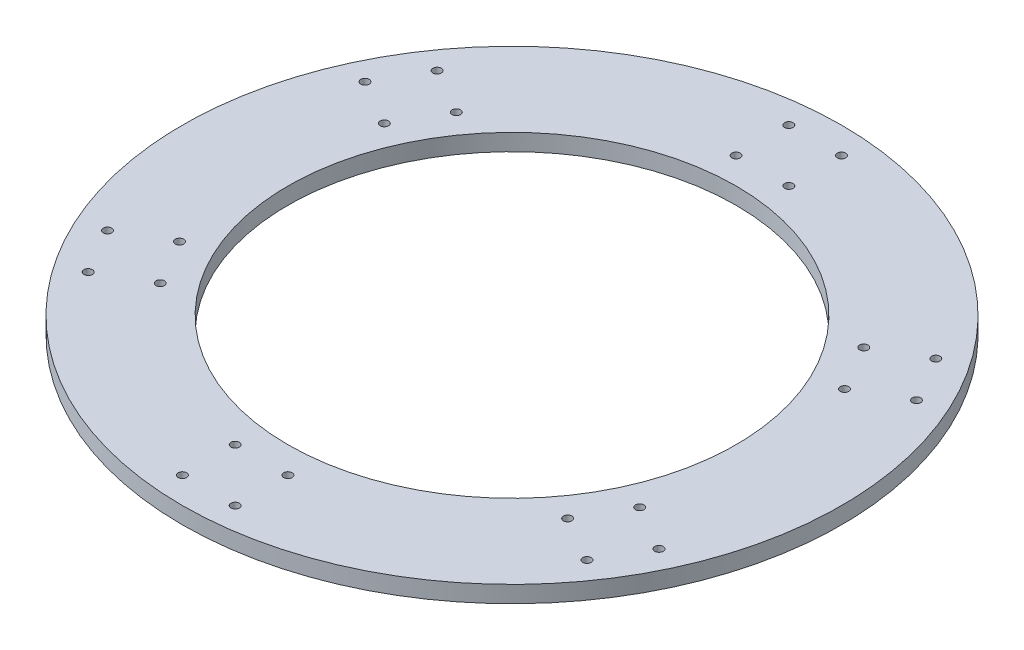
ISO-10303-21;
HEADER;
FILE_DESCRIPTION(('STEP AP214'),'2;1');
FILE_NAME('part.step','',(''),(''),'','','');
FILE_SCHEMA(('AUTOMOTIVE_DESIGN { 1 0 10303 214 1 1 1 1 }'));
ENDSEC;
DATA;
#1=APPLICATION_CONTEXT('core data for automotive mechanical design processes');
#2=APPLICATION_PROTOCOL_DEFINITION('international standard','automotive_design',2000,#1);
#3=PRODUCT_CONTEXT('',#1,'mechanical');
#4=PRODUCT('Part','Part','',(#3));
#5=PRODUCT_RELATED_PRODUCT_CATEGORY('part','',(#4));
#6=PRODUCT_DEFINITION_FORMATION('','',#4);
#7=PRODUCT_DEFINITION_CONTEXT('part definition',#1,'design');
#8=PRODUCT_DEFINITION('design','',#6,#7);
#9=PRODUCT_DEFINITION_SHAPE('','',#8);
#10=(LENGTH_UNIT() NAMED_UNIT(*) SI_UNIT(.MILLI.,.METRE.));
#11=(NAMED_UNIT(*) PLANE_ANGLE_UNIT() SI_UNIT($,.RADIAN.));
#12=(NAMED_UNIT(*) SI_UNIT($,.STERADIAN.) SOLID_ANGLE_UNIT());
#13=UNCERTAINTY_MEASURE_WITH_UNIT(LENGTH_MEASURE(1.E-05),#10,'distance_accuracy_value','');
#14=(GEOMETRIC_REPRESENTATION_CONTEXT(3) GLOBAL_UNCERTAINTY_ASSIGNED_CONTEXT((#13)) GLOBAL_UNIT_ASSIGNED_CONTEXT((#10,
#11,#12)) REPRESENTATION_CONTEXT('',''));
#15=CARTESIAN_POINT('',(0.,0.,0.));
#16=DIRECTION('',(0.,0.,1.));
#17=DIRECTION('',(1.,0.,0.));
#18=AXIS2_PLACEMENT_3D('',#15,#16,#17);
#19=CARTESIAN_POINT('',(0.,6.35,0.));
#20=DIRECTION('',(0.,1.,0.));
#21=DIRECTION('',(0.,0.,1.));
#22=AXIS2_PLACEMENT_3D('',#19,#20,#21);
#23=PLANE('',#22);
#24=CARTESIAN_POINT('',(-10.,6.35,95.));
#25=DIRECTION('',(0.,-1.,0.));
#26=DIRECTION('',(0.,0.,-1.));
#27=AXIS2_PLACEMENT_3D('',#24,#25,#26);
#28=CIRCLE('',#27,1.6);
#29=CARTESIAN_POINT('',(-10.,6.35,93.4));
#30=VERTEX_POINT('',#29);
#31=EDGE_CURVE('E189',#30,#30,#28,.T.);
#32=ORIENTED_EDGE('',*,*,#31,.T.);
#33=EDGE_LOOP('',(#32));
#34=FACE_BOUND('',#33,.T.);
#35=CARTESIAN_POINT('',(9.99999999999998,6.35,95.));
#36=DIRECTION('',(0.,-1.,0.));
#37=DIRECTION('',(0.,0.,-1.));
#38=AXIS2_PLACEMENT_3D('',#35,#36,#37);
#39=CIRCLE('',#38,1.6);
#40=CARTESIAN_POINT('',(9.99999999999998,6.35,93.4));
#41=VERTEX_POINT('',#40);
#42=EDGE_CURVE('E183',#41,#41,#39,.T.);
#43=ORIENTED_EDGE('',*,*,#42,.T.);
#44=EDGE_LOOP('',(#43));
#45=FACE_BOUND('',#44,.T.);
#46=CARTESIAN_POINT('',(-10.,6.35,115.));
#47=DIRECTION('',(0.,-1.,0.));
#48=DIRECTION('',(0.,0.,-1.));
#49=AXIS2_PLACEMENT_3D('',#46,#47,#48);
#50=CIRCLE('',#49,1.6);
#51=CARTESIAN_POINT('',(-10.,6.35,113.4));
#52=VERTEX_POINT('',#51);
#53=EDGE_CURVE('E177',#52,#52,#50,.T.);
#54=ORIENTED_EDGE('',*,*,#53,.T.);
#55=EDGE_LOOP('',(#54));
#56=FACE_BOUND('',#55,.T.);
#57=CARTESIAN_POINT('',(94.5929214352102,6.35,-66.1602540378448));
#58=DIRECTION('',(0.,-1.,0.));
#59=DIRECTION('',(0.,0.,-1.));
#60=AXIS2_PLACEMENT_3D('',#57,#58,#59);
#61=CIRCLE('',#60,1.6);
#62=CARTESIAN_POINT('',(94.5929214352102,6.35,-67.7602540378448));
#63=VERTEX_POINT('',#62);
#64=EDGE_CURVE('E129',#63,#63,#61,.T.);
#65=ORIENTED_EDGE('',*,*,#64,.T.);
#66=EDGE_LOOP('',(#65));
#67=FACE_BOUND('',#66,.T.);
#68=CARTESIAN_POINT('',(77.2724133595218,6.35,56.1602540378443));
#69=DIRECTION('',(0.,-1.,0.));
#70=DIRECTION('',(0.,0.,-1.));
#71=AXIS2_PLACEMENT_3D('',#68,#69,#70);
#72=CIRCLE('',#71,1.6);
#73=CARTESIAN_POINT('',(77.2724133595218,6.35,54.5602540378443));
#74=VERTEX_POINT('',#73);
#75=EDGE_CURVE('E123',#74,#74,#72,.T.);
#76=ORIENTED_EDGE('',*,*,#75,.T.);
#77=EDGE_LOOP('',(#76));
#78=FACE_BOUND('',#77,.T.);
#79=CARTESIAN_POINT('',(9.99999999999935,6.35,-95.0000000000001));
#80=DIRECTION('',(0.,-1.,0.));
#81=DIRECTION('',(0.,0.,-1.));
#82=AXIS2_PLACEMENT_3D('',#79,#80,#81);
#83=CIRCLE('',#82,1.6);
#84=CARTESIAN_POINT('',(9.99999999999935,6.35,-96.6000000000001));
#85=VERTEX_POINT('',#84);
#86=EDGE_CURVE('E117',#85,#85,#83,.T.);
#87=ORIENTED_EDGE('',*,*,#86,.T.);
#88=EDGE_LOOP('',(#87));
#89=FACE_BOUND('',#88,.T.);
#90=CARTESIAN_POINT('',(-10.0000000000006,6.35,-95.));
#91=DIRECTION('',(0.,-1.,0.));
#92=DIRECTION('',(0.,0.,-1.));
#93=AXIS2_PLACEMENT_3D('',#90,#91,#92);
#94=CIRCLE('',#93,1.6);
#95=CARTESIAN_POINT('',(-10.0000000000006,6.35,-96.6));
#96=VERTEX_POINT('',#95);
#97=EDGE_CURVE('E111',#96,#96,#94,.T.);
#98=ORIENTED_EDGE('',*,*,#97,.T.);
#99=EDGE_LOOP('',(#98));
#100=FACE_BOUND('',#99,.T.);
#101=CARTESIAN_POINT('',(9.99999999999921,6.35,-115.));
#102=DIRECTION('',(0.,-1.,0.));
#103=DIRECTION('',(0.,0.,-1.));
#104=AXIS2_PLACEMENT_3D('',#101,#102,#103);
#105=CIRCLE('',#104,1.6);
#106=CARTESIAN_POINT('',(9.99999999999921,6.35,-116.6));
#107=VERTEX_POINT('',#106);
#108=EDGE_CURVE('E105',#107,#107,#105,.T.);
#109=ORIENTED_EDGE('',*,*,#108,.T.);
#110=EDGE_LOOP('',(#109));
#111=FACE_BOUND('',#110,.T.);
#112=CARTESIAN_POINT('',(-10.0000000000008,6.35,-115.));
#113=DIRECTION('',(0.,-1.,0.));
#114=DIRECTION('',(0.,0.,-1.));
#115=AXIS2_PLACEMENT_3D('',#112,#113,#114);
#116=CIRCLE('',#115,1.6);
#117=CARTESIAN_POINT('',(-10.0000000000008,6.35,-116.6));
#118=VERTEX_POINT('',#117);
#119=EDGE_CURVE('E99',#118,#118,#116,.T.);
#120=ORIENTED_EDGE('',*,*,#119,.T.);
#121=EDGE_LOOP('',(#120));
#122=FACE_BOUND('',#121,.T.);
#123=CARTESIAN_POINT('',(-77.2724133595222,6.35,-56.1602540378437));
#124=DIRECTION('',(0.,-1.,0.));
#125=DIRECTION('',(0.,0.,-1.));
#126=AXIS2_PLACEMENT_3D('',#123,#124,#125);
#127=CIRCLE('',#126,1.6);
#128=CARTESIAN_POINT('',(-77.2724133595222,6.35,-57.7602540378437));
#129=VERTEX_POINT('',#128);
#130=EDGE_CURVE('E93',#129,#129,#127,.T.);
#131=ORIENTED_EDGE('',*,*,#130,.T.);
#132=EDGE_LOOP('',(#131));
#133=FACE_BOUND('',#132,.T.);
#134=CARTESIAN_POINT('',(-87.272413359522,6.35,-38.8397459621548));
#135=DIRECTION('',(0.,-1.,0.));
#136=DIRECTION('',(0.,0.,-1.));
#137=AXIS2_PLACEMENT_3D('',#134,#135,#136);
#138=CIRCLE('',#137,1.6);
#139=CARTESIAN_POINT('',(-87.272413359522,6.35,-40.4397459621548));
#140=VERTEX_POINT('',#139);
#141=EDGE_CURVE('E87',#140,#140,#138,.T.);
#142=ORIENTED_EDGE('',*,*,#141,.T.);
#143=EDGE_LOOP('',(#142));
#144=FACE_BOUND('',#143,.T.);
#145=CARTESIAN_POINT('',(-94.5929214352111,6.35,-66.1602540378435));
#146=DIRECTION('',(0.,-1.,0.));
#147=DIRECTION('',(0.,0.,-1.));
#148=AXIS2_PLACEMENT_3D('',#145,#146,#147);
#149=CIRCLE('',#148,1.6);
#150=CARTESIAN_POINT('',(-94.5929214352111,6.35,-67.7602540378435));
#151=VERTEX_POINT('',#150);
#152=EDGE_CURVE('E81',#151,#151,#149,.T.);
#153=ORIENTED_EDGE('',*,*,#152,.T.);
#154=EDGE_LOOP('',(#153));
#155=FACE_BOUND('',#154,.T.);
#156=CARTESIAN_POINT('',(-104.592921435211,6.35,-48.8397459621547));
#157=DIRECTION('',(0.,-1.,0.));
#158=DIRECTION('',(0.,0.,-1.));
#159=AXIS2_PLACEMENT_3D('',#156,#157,#158);
#160=CIRCLE('',#159,1.6);
#161=CARTESIAN_POINT('',(-104.592921435211,6.35,-50.4397459621547));
#162=VERTEX_POINT('',#161);
#163=EDGE_CURVE('E75',#162,#162,#160,.T.);
#164=ORIENTED_EDGE('',*,*,#163,.T.);
#165=EDGE_LOOP('',(#164));
#166=FACE_BOUND('',#165,.T.);
#167=CARTESIAN_POINT('',(-87.2724133595212,6.35,38.8397459621566));
#168=DIRECTION('',(0.,-1.,0.));
#169=DIRECTION('',(0.,0.,-1.));
#170=AXIS2_PLACEMENT_3D('',#167,#168,#169);
#171=CIRCLE('',#170,1.6);
#172=CARTESIAN_POINT('',(-87.2724133595212,6.35,37.2397459621566));
#173=VERTEX_POINT('',#172);
#174=EDGE_CURVE('E69',#173,#173,#171,.T.);
#175=ORIENTED_EDGE('',*,*,#174,.T.);
#176=EDGE_LOOP('',(#175));
#177=FACE_BOUND('',#176,.T.);
#178=CARTESIAN_POINT('',(-77.272413359521,6.35,56.1602540378453));
#179=DIRECTION('',(0.,-1.,0.));
#180=DIRECTION('',(0.,0.,-1.));
#181=AXIS2_PLACEMENT_3D('',#178,#179,#180);
#182=CIRCLE('',#181,1.6);
#183=CARTESIAN_POINT('',(-77.272413359521,6.35,54.5602540378452));
#184=VERTEX_POINT('',#183);
#185=EDGE_CURVE('E63',#184,#184,#182,.T.);
#186=ORIENTED_EDGE('',*,*,#185,.T.);
#187=EDGE_LOOP('',(#186));
#188=FACE_BOUND('',#187,.T.);
#189=CARTESIAN_POINT('',(-104.59292143521,6.35,48.8397459621568));
#190=DIRECTION('',(0.,-1.,0.));
#191=DIRECTION('',(0.,0.,-1.));
#192=AXIS2_PLACEMENT_3D('',#189,#190,#191);
#193=CIRCLE('',#192,1.6);
#194=CARTESIAN_POINT('',(-104.59292143521,6.35,47.2397459621568));
#195=VERTEX_POINT('',#194);
#196=EDGE_CURVE('E57',#195,#195,#193,.T.);
#197=ORIENTED_EDGE('',*,*,#196,.T.);
#198=EDGE_LOOP('',(#197));
#199=FACE_BOUND('',#198,.T.);
#200=CARTESIAN_POINT('',(-94.5929214352097,6.35,66.1602540378455));
#201=DIRECTION('',(0.,-1.,0.));
#202=DIRECTION('',(0.,0.,-1.));
#203=AXIS2_PLACEMENT_3D('',#200,#201,#202);
#204=CIRCLE('',#203,1.6);
#205=CARTESIAN_POINT('',(-94.5929214352097,6.35,64.5602540378455));
#206=VERTEX_POINT('',#205);
#207=EDGE_CURVE('E49',#206,#206,#204,.T.);
#208=ORIENTED_EDGE('',*,*,#207,.T.);
#209=EDGE_LOOP('',(#208));
#210=FACE_BOUND('',#209,.T.);
#211=CARTESIAN_POINT('',(0.,6.35,0.));
#212=DIRECTION('',(0.,1.,0.));
#213=DIRECTION('',(0.,0.,1.));
#214=AXIS2_PLACEMENT_3D('',#211,#212,#213);
#215=CIRCLE('',#214,85.);
#216=CARTESIAN_POINT('',(0.,6.35,85.));
#217=VERTEX_POINT('',#216);
#218=EDGE_CURVE('E44',#217,#217,#215,.T.);
#219=ORIENTED_EDGE('',*,*,#218,.F.);
#220=EDGE_LOOP('',(#219));
#221=FACE_BOUND('',#220,.T.);
#222=CARTESIAN_POINT('',(0.,6.35,0.));
#223=DIRECTION('',(0.,1.,0.));
#224=DIRECTION('',(0.,0.,1.));
#225=AXIS2_PLACEMENT_3D('',#222,#223,#224);
#226=CIRCLE('',#225,125.);
#227=CARTESIAN_POINT('',(0.,6.35,125.));
#228=VERTEX_POINT('',#227);
#229=EDGE_CURVE('E10',#228,#228,#226,.T.);
#230=ORIENTED_EDGE('',*,*,#229,.T.);
#231=EDGE_LOOP('',(#230));
#232=FACE_BOUND('',#231,.T.);
#233=CARTESIAN_POINT('',(104.59292143521,6.35,-48.839745962156));
#234=DIRECTION('',(0.,-1.,0.));
#235=DIRECTION('',(0.,0.,-1.));
#236=AXIS2_PLACEMENT_3D('',#233,#234,#235);
#237=CIRCLE('',#236,1.6);
#238=CARTESIAN_POINT('',(104.59292143521,6.35,-50.439745962156));
#239=VERTEX_POINT('',#238);
#240=EDGE_CURVE('E135',#239,#239,#237,.T.);
#241=ORIENTED_EDGE('',*,*,#240,.T.);
#242=EDGE_LOOP('',(#241));
#243=FACE_BOUND('',#242,.T.);
#244=CARTESIAN_POINT('',(77.2724133595215,6.35,-56.1602540378447));
#245=DIRECTION('',(0.,-1.,0.));
#246=DIRECTION('',(0.,0.,-1.));
#247=AXIS2_PLACEMENT_3D('',#244,#245,#246);
#248=CIRCLE('',#247,1.6);
#249=CARTESIAN_POINT('',(77.2724133595215,6.35,-57.7602540378447));
#250=VERTEX_POINT('',#249);
#251=EDGE_CURVE('E141',#250,#250,#248,.T.);
#252=ORIENTED_EDGE('',*,*,#251,.T.);
#253=EDGE_LOOP('',(#252));
#254=FACE_BOUND('',#253,.T.);
#255=CARTESIAN_POINT('',(87.2724133595216,6.35,-38.839745962156));
#256=DIRECTION('',(0.,-1.,0.));
#257=DIRECTION('',(0.,0.,-1.));
#258=AXIS2_PLACEMENT_3D('',#255,#256,#257);
#259=CIRCLE('',#258,1.6);
#260=CARTESIAN_POINT('',(87.2724133595216,6.35,-40.439745962156));
#261=VERTEX_POINT('',#260);
#262=EDGE_CURVE('E147',#261,#261,#259,.T.);
#263=ORIENTED_EDGE('',*,*,#262,.T.);
#264=EDGE_LOOP('',(#263));
#265=FACE_BOUND('',#264,.T.);
#266=CARTESIAN_POINT('',(104.592921435211,6.35,48.8397459621538));
#267=DIRECTION('',(0.,-1.,0.));
#268=DIRECTION('',(0.,0.,-1.));
#269=AXIS2_PLACEMENT_3D('',#266,#267,#268);
#270=CIRCLE('',#269,1.6);
#271=CARTESIAN_POINT('',(104.592921435211,6.35,47.2397459621538));
#272=VERTEX_POINT('',#271);
#273=EDGE_CURVE('E153',#272,#272,#270,.T.);
#274=ORIENTED_EDGE('',*,*,#273,.T.);
#275=EDGE_LOOP('',(#274));
#276=FACE_BOUND('',#275,.T.);
#277=CARTESIAN_POINT('',(94.5929214352116,6.35,66.1602540378428));
#278=DIRECTION('',(0.,-1.,0.));
#279=DIRECTION('',(0.,0.,-1.));
#280=AXIS2_PLACEMENT_3D('',#277,#278,#279);
#281=CIRCLE('',#280,1.6);
#282=CARTESIAN_POINT('',(94.5929214352116,6.35,64.5602540378428));
#283=VERTEX_POINT('',#282);
#284=EDGE_CURVE('E159',#283,#283,#281,.T.);
#285=ORIENTED_EDGE('',*,*,#284,.T.);
#286=EDGE_LOOP('',(#285));
#287=FACE_BOUND('',#286,.T.);
#288=CARTESIAN_POINT('',(87.2724133595223,6.35,38.8397459621541));
#289=DIRECTION('',(0.,-1.,0.));
#290=DIRECTION('',(0.,0.,-1.));
#291=AXIS2_PLACEMENT_3D('',#288,#289,#290);
#292=CIRCLE('',#291,1.6);
#293=CARTESIAN_POINT('',(87.2724133595223,6.35,37.2397459621541));
#294=VERTEX_POINT('',#293);
#295=EDGE_CURVE('E165',#294,#294,#292,.T.);
#296=ORIENTED_EDGE('',*,*,#295,.T.);
#297=EDGE_LOOP('',(#296));
#298=FACE_BOUND('',#297,.T.);
#299=CARTESIAN_POINT('',(9.99999999999999,6.35,115.));
#300=DIRECTION('',(0.,-1.,0.));
#301=DIRECTION('',(0.,0.,-1.));
#302=AXIS2_PLACEMENT_3D('',#299,#300,#301);
#303=CIRCLE('',#302,1.6);
#304=CARTESIAN_POINT('',(9.99999999999999,6.35,113.4));
#305=VERTEX_POINT('',#304);
#306=EDGE_CURVE('E171',#305,#305,#303,.T.);
#307=ORIENTED_EDGE('',*,*,#306,.T.);
#308=EDGE_LOOP('',(#307));
#309=FACE_BOUND('',#308,.T.);
#310=ADVANCED_FACE('F33',(#34,#45,#56,#67,#78,#89,#100,#111,#122,#133,#144,#155,#166,#177,#188,
#199,#210,#221,#232,#243,#254,#265,#276,#287,#298,#309),#23,.T.);
#311=CARTESIAN_POINT('',(0.,0.,0.));
#312=DIRECTION('',(0.,1.,0.));
#313=DIRECTION('',(0.,0.,1.));
#314=AXIS2_PLACEMENT_3D('',#311,#312,#313);
#315=PLANE('',#314);
#316=CARTESIAN_POINT('',(-10.,0.,95.));
#317=DIRECTION('',(0.,-1.,0.));
#318=DIRECTION('',(0.,0.,-1.));
#319=AXIS2_PLACEMENT_3D('',#316,#317,#318);
#320=CIRCLE('',#319,1.6);
#321=CARTESIAN_POINT('',(-10.,0.,93.4));
#322=VERTEX_POINT('',#321);
#323=EDGE_CURVE('E192',#322,#322,#320,.T.);
#324=ORIENTED_EDGE('',*,*,#323,.F.);
#325=EDGE_LOOP('',(#324));
#326=FACE_BOUND('',#325,.T.);
#327=CARTESIAN_POINT('',(9.99999999999998,0.,95.));
#328=DIRECTION('',(0.,-1.,0.));
#329=DIRECTION('',(0.,0.,-1.));
#330=AXIS2_PLACEMENT_3D('',#327,#328,#329);
#331=CIRCLE('',#330,1.6);
#332=CARTESIAN_POINT('',(9.99999999999998,0.,93.4));
#333=VERTEX_POINT('',#332);
#334=EDGE_CURVE('E186',#333,#333,#331,.T.);
#335=ORIENTED_EDGE('',*,*,#334,.F.);
#336=EDGE_LOOP('',(#335));
#337=FACE_BOUND('',#336,.T.);
#338=CARTESIAN_POINT('',(-10.,0.,115.));
#339=DIRECTION('',(0.,-1.,0.));
#340=DIRECTION('',(0.,0.,-1.));
#341=AXIS2_PLACEMENT_3D('',#338,#339,#340);
#342=CIRCLE('',#341,1.6);
#343=CARTESIAN_POINT('',(-10.,0.,113.4));
#344=VERTEX_POINT('',#343);
#345=EDGE_CURVE('E180',#344,#344,#342,.T.);
#346=ORIENTED_EDGE('',*,*,#345,.F.);
#347=EDGE_LOOP('',(#346));
#348=FACE_BOUND('',#347,.T.);
#349=CARTESIAN_POINT('',(87.2724133595223,0.,38.8397459621541));
#350=DIRECTION('',(0.,-1.,0.));
#351=DIRECTION('',(0.,0.,-1.));
#352=AXIS2_PLACEMENT_3D('',#349,#350,#351);
#353=CIRCLE('',#352,1.6);
#354=CARTESIAN_POINT('',(87.2724133595223,0.,37.2397459621541));
#355=VERTEX_POINT('',#354);
#356=EDGE_CURVE('E168',#355,#355,#353,.T.);
#357=ORIENTED_EDGE('',*,*,#356,.F.);
#358=EDGE_LOOP('',(#357));
#359=FACE_BOUND('',#358,.T.);
#360=CARTESIAN_POINT('',(94.5929214352116,0.,66.1602540378428));
#361=DIRECTION('',(0.,-1.,0.));
#362=DIRECTION('',(0.,0.,-1.));
#363=AXIS2_PLACEMENT_3D('',#360,#361,#362);
#364=CIRCLE('',#363,1.6);
#365=CARTESIAN_POINT('',(94.5929214352116,0.,64.5602540378428));
#366=VERTEX_POINT('',#365);
#367=EDGE_CURVE('E162',#366,#366,#364,.T.);
#368=ORIENTED_EDGE('',*,*,#367,.F.);
#369=EDGE_LOOP('',(#368));
#370=FACE_BOUND('',#369,.T.);
#371=CARTESIAN_POINT('',(104.592921435211,0.,48.8397459621538));
#372=DIRECTION('',(0.,-1.,0.));
#373=DIRECTION('',(0.,0.,-1.));
#374=AXIS2_PLACEMENT_3D('',#371,#372,#373);
#375=CIRCLE('',#374,1.6);
#376=CARTESIAN_POINT('',(104.592921435211,0.,47.2397459621538));
#377=VERTEX_POINT('',#376);
#378=EDGE_CURVE('E156',#377,#377,#375,.T.);
#379=ORIENTED_EDGE('',*,*,#378,.F.);
#380=EDGE_LOOP('',(#379));
#381=FACE_BOUND('',#380,.T.);
#382=CARTESIAN_POINT('',(87.2724133595216,0.,-38.839745962156));
#383=DIRECTION('',(0.,-1.,0.));
#384=DIRECTION('',(0.,0.,-1.));
#385=AXIS2_PLACEMENT_3D('',#382,#383,#384);
#386=CIRCLE('',#385,1.6);
#387=CARTESIAN_POINT('',(87.2724133595216,0.,-40.439745962156));
#388=VERTEX_POINT('',#387);
#389=EDGE_CURVE('E150',#388,#388,#386,.T.);
#390=ORIENTED_EDGE('',*,*,#389,.F.);
#391=EDGE_LOOP('',(#390));
#392=FACE_BOUND('',#391,.T.);
#393=CARTESIAN_POINT('',(77.2724133595215,0.,-56.1602540378447));
#394=DIRECTION('',(0.,-1.,0.));
#395=DIRECTION('',(0.,0.,-1.));
#396=AXIS2_PLACEMENT_3D('',#393,#394,#395);
#397=CIRCLE('',#396,1.6);
#398=CARTESIAN_POINT('',(77.2724133595215,0.,-57.7602540378447));
#399=VERTEX_POINT('',#398);
#400=EDGE_CURVE('E144',#399,#399,#397,.T.);
#401=ORIENTED_EDGE('',*,*,#400,.F.);
#402=EDGE_LOOP('',(#401));
#403=FACE_BOUND('',#402,.T.);
#404=CARTESIAN_POINT('',(104.59292143521,0.,-48.839745962156));
#405=DIRECTION('',(0.,-1.,0.));
#406=DIRECTION('',(0.,0.,-1.));
#407=AXIS2_PLACEMENT_3D('',#404,#405,#406);
#408=CIRCLE('',#407,1.6);
#409=CARTESIAN_POINT('',(104.59292143521,0.,-50.439745962156));
#410=VERTEX_POINT('',#409);
#411=EDGE_CURVE('E138',#410,#410,#408,.T.);
#412=ORIENTED_EDGE('',*,*,#411,.F.);
#413=EDGE_LOOP('',(#412));
#414=FACE_BOUND('',#413,.T.);
#415=CARTESIAN_POINT('',(77.2724133595218,0.,56.1602540378443));
#416=DIRECTION('',(0.,-1.,0.));
#417=DIRECTION('',(0.,0.,-1.));
#418=AXIS2_PLACEMENT_3D('',#415,#416,#417);
#419=CIRCLE('',#418,1.6);
#420=CARTESIAN_POINT('',(77.2724133595218,0.,54.5602540378443));
#421=VERTEX_POINT('',#420);
#422=EDGE_CURVE('E126',#421,#421,#419,.T.);
#423=ORIENTED_EDGE('',*,*,#422,.F.);
#424=EDGE_LOOP('',(#423));
#425=FACE_BOUND('',#424,.T.);
#426=CARTESIAN_POINT('',(9.99999999999935,0.,-95.0000000000001));
#427=DIRECTION('',(0.,-1.,0.));
#428=DIRECTION('',(0.,0.,-1.));
#429=AXIS2_PLACEMENT_3D('',#426,#427,#428);
#430=CIRCLE('',#429,1.6);
#431=CARTESIAN_POINT('',(9.99999999999935,0.,-96.6000000000001));
#432=VERTEX_POINT('',#431);
#433=EDGE_CURVE('E120',#432,#432,#430,.T.);
#434=ORIENTED_EDGE('',*,*,#433,.F.);
#435=EDGE_LOOP('',(#434));
#436=FACE_BOUND('',#435,.T.);
#437=CARTESIAN_POINT('',(-10.0000000000006,0.,-95.));
#438=DIRECTION('',(0.,-1.,0.));
#439=DIRECTION('',(0.,0.,-1.));
#440=AXIS2_PLACEMENT_3D('',#437,#438,#439);
#441=CIRCLE('',#440,1.6);
#442=CARTESIAN_POINT('',(-10.0000000000006,0.,-96.6));
#443=VERTEX_POINT('',#442);
#444=EDGE_CURVE('E114',#443,#443,#441,.T.);
#445=ORIENTED_EDGE('',*,*,#444,.F.);
#446=EDGE_LOOP('',(#445));
#447=FACE_BOUND('',#446,.T.);
#448=CARTESIAN_POINT('',(9.99999999999921,0.,-115.));
#449=DIRECTION('',(0.,-1.,0.));
#450=DIRECTION('',(0.,0.,-1.));
#451=AXIS2_PLACEMENT_3D('',#448,#449,#450);
#452=CIRCLE('',#451,1.6);
#453=CARTESIAN_POINT('',(9.99999999999921,0.,-116.6));
#454=VERTEX_POINT('',#453);
#455=EDGE_CURVE('E108',#454,#454,#452,.T.);
#456=ORIENTED_EDGE('',*,*,#455,.F.);
#457=EDGE_LOOP('',(#456));
#458=FACE_BOUND('',#457,.T.);
#459=CARTESIAN_POINT('',(-10.0000000000008,0.,-115.));
#460=DIRECTION('',(0.,-1.,0.));
#461=DIRECTION('',(0.,0.,-1.));
#462=AXIS2_PLACEMENT_3D('',#459,#460,#461);
#463=CIRCLE('',#462,1.6);
#464=CARTESIAN_POINT('',(-10.0000000000008,0.,-116.6));
#465=VERTEX_POINT('',#464);
#466=EDGE_CURVE('E102',#465,#465,#463,.T.);
#467=ORIENTED_EDGE('',*,*,#466,.F.);
#468=EDGE_LOOP('',(#467));
#469=FACE_BOUND('',#468,.T.);
#470=CARTESIAN_POINT('',(-77.2724133595222,0.,-56.1602540378437));
#471=DIRECTION('',(0.,-1.,0.));
#472=DIRECTION('',(0.,0.,-1.));
#473=AXIS2_PLACEMENT_3D('',#470,#471,#472);
#474=CIRCLE('',#473,1.6);
#475=CARTESIAN_POINT('',(-77.2724133595222,0.,-57.7602540378437));
#476=VERTEX_POINT('',#475);
#477=EDGE_CURVE('E96',#476,#476,#474,.T.);
#478=ORIENTED_EDGE('',*,*,#477,.F.);
#479=EDGE_LOOP('',(#478));
#480=FACE_BOUND('',#479,.T.);
#481=CARTESIAN_POINT('',(-87.272413359522,0.,-38.8397459621548));
#482=DIRECTION('',(0.,-1.,0.));
#483=DIRECTION('',(0.,0.,-1.));
#484=AXIS2_PLACEMENT_3D('',#481,#482,#483);
#485=CIRCLE('',#484,1.6);
#486=CARTESIAN_POINT('',(-87.272413359522,0.,-40.4397459621548));
#487=VERTEX_POINT('',#486);
#488=EDGE_CURVE('E90',#487,#487,#485,.T.);
#489=ORIENTED_EDGE('',*,*,#488,.F.);
#490=EDGE_LOOP('',(#489));
#491=FACE_BOUND('',#490,.T.);
#492=CARTESIAN_POINT('',(-94.5929214352111,0.,-66.1602540378435));
#493=DIRECTION('',(0.,-1.,0.));
#494=DIRECTION('',(0.,0.,-1.));
#495=AXIS2_PLACEMENT_3D('',#492,#493,#494);
#496=CIRCLE('',#495,1.6);
#497=CARTESIAN_POINT('',(-94.5929214352111,0.,-67.7602540378435));
#498=VERTEX_POINT('',#497);
#499=EDGE_CURVE('E84',#498,#498,#496,.T.);
#500=ORIENTED_EDGE('',*,*,#499,.F.);
#501=EDGE_LOOP('',(#500));
#502=FACE_BOUND('',#501,.T.);
#503=CARTESIAN_POINT('',(-104.592921435211,0.,-48.8397459621547));
#504=DIRECTION('',(0.,-1.,0.));
#505=DIRECTION('',(0.,0.,-1.));
#506=AXIS2_PLACEMENT_3D('',#503,#504,#505);
#507=CIRCLE('',#506,1.6);
#508=CARTESIAN_POINT('',(-104.592921435211,0.,-50.4397459621547));
#509=VERTEX_POINT('',#508);
#510=EDGE_CURVE('E78',#509,#509,#507,.T.);
#511=ORIENTED_EDGE('',*,*,#510,.F.);
#512=EDGE_LOOP('',(#511));
#513=FACE_BOUND('',#512,.T.);
#514=CARTESIAN_POINT('',(-87.2724133595212,0.,38.8397459621566));
#515=DIRECTION('',(0.,-1.,0.));
#516=DIRECTION('',(0.,0.,-1.));
#517=AXIS2_PLACEMENT_3D('',#514,#515,#516);
#518=CIRCLE('',#517,1.6);
#519=CARTESIAN_POINT('',(-87.2724133595212,0.,37.2397459621566));
#520=VERTEX_POINT('',#519);
#521=EDGE_CURVE('E72',#520,#520,#518,.T.);
#522=ORIENTED_EDGE('',*,*,#521,.F.);
#523=EDGE_LOOP('',(#522));
#524=FACE_BOUND('',#523,.T.);
#525=CARTESIAN_POINT('',(-77.272413359521,0.,56.1602540378453));
#526=DIRECTION('',(0.,-1.,0.));
#527=DIRECTION('',(0.,0.,-1.));
#528=AXIS2_PLACEMENT_3D('',#525,#526,#527);
#529=CIRCLE('',#528,1.6);
#530=CARTESIAN_POINT('',(-77.272413359521,0.,54.5602540378452));
#531=VERTEX_POINT('',#530);
#532=EDGE_CURVE('E66',#531,#531,#529,.T.);
#533=ORIENTED_EDGE('',*,*,#532,.F.);
#534=EDGE_LOOP('',(#533));
#535=FACE_BOUND('',#534,.T.);
#536=CARTESIAN_POINT('',(-104.59292143521,0.,48.8397459621568));
#537=DIRECTION('',(0.,-1.,0.));
#538=DIRECTION('',(0.,0.,-1.));
#539=AXIS2_PLACEMENT_3D('',#536,#537,#538);
#540=CIRCLE('',#539,1.6);
#541=CARTESIAN_POINT('',(-104.59292143521,0.,47.2397459621568));
#542=VERTEX_POINT('',#541);
#543=EDGE_CURVE('E60',#542,#542,#540,.T.);
#544=ORIENTED_EDGE('',*,*,#543,.F.);
#545=EDGE_LOOP('',(#544));
#546=FACE_BOUND('',#545,.T.);
#547=CARTESIAN_POINT('',(-94.5929214352097,0.,66.1602540378455));
#548=DIRECTION('',(0.,-1.,0.));
#549=DIRECTION('',(0.,0.,-1.));
#550=AXIS2_PLACEMENT_3D('',#547,#548,#549);
#551=CIRCLE('',#550,1.6);
#552=CARTESIAN_POINT('',(-94.5929214352097,0.,64.5602540378455));
#553=VERTEX_POINT('',#552);
#554=EDGE_CURVE('E54',#553,#553,#551,.T.);
#555=ORIENTED_EDGE('',*,*,#554,.F.);
#556=EDGE_LOOP('',(#555));
#557=FACE_BOUND('',#556,.T.);
#558=CARTESIAN_POINT('',(0.,0.,0.));
#559=DIRECTION('',(0.,1.,0.));
#560=DIRECTION('',(0.,0.,1.));
#561=AXIS2_PLACEMENT_3D('',#558,#559,#560);
#562=CIRCLE('',#561,85.);
#563=CARTESIAN_POINT('',(0.,0.,85.));
#564=VERTEX_POINT('',#563);
#565=EDGE_CURVE('E46',#564,#564,#562,.T.);
#566=ORIENTED_EDGE('',*,*,#565,.T.);
#567=EDGE_LOOP('',(#566));
#568=FACE_BOUND('',#567,.T.);
#569=CARTESIAN_POINT('',(0.,0.,0.));
#570=DIRECTION('',(0.,1.,0.));
#571=DIRECTION('',(0.,0.,1.));
#572=AXIS2_PLACEMENT_3D('',#569,#570,#571);
#573=CIRCLE('',#572,125.);
#574=CARTESIAN_POINT('',(0.,0.,125.));
#575=VERTEX_POINT('',#574);
#576=EDGE_CURVE('E37',#575,#575,#573,.T.);
#577=ORIENTED_EDGE('',*,*,#576,.F.);
#578=EDGE_LOOP('',(#577));
#579=FACE_BOUND('',#578,.T.);
#580=CARTESIAN_POINT('',(94.5929214352102,0.,-66.1602540378448));
#581=DIRECTION('',(0.,-1.,0.));
#582=DIRECTION('',(0.,0.,-1.));
#583=AXIS2_PLACEMENT_3D('',#580,#581,#582);
#584=CIRCLE('',#583,1.6);
#585=CARTESIAN_POINT('',(94.5929214352102,0.,-67.7602540378448));
#586=VERTEX_POINT('',#585);
#587=EDGE_CURVE('E132',#586,#586,#584,.T.);
#588=ORIENTED_EDGE('',*,*,#587,.F.);
#589=EDGE_LOOP('',(#588));
#590=FACE_BOUND('',#589,.T.);
#591=CARTESIAN_POINT('',(9.99999999999999,0.,115.));
#592=DIRECTION('',(0.,-1.,0.));
#593=DIRECTION('',(0.,0.,-1.));
#594=AXIS2_PLACEMENT_3D('',#591,#592,#593);
#595=CIRCLE('',#594,1.6);
#596=CARTESIAN_POINT('',(9.99999999999999,0.,113.4));
#597=VERTEX_POINT('',#596);
#598=EDGE_CURVE('E174',#597,#597,#595,.T.);
#599=ORIENTED_EDGE('',*,*,#598,.F.);
#600=EDGE_LOOP('',(#599));
#601=FACE_BOUND('',#600,.T.);
#602=ADVANCED_FACE('F198',(#326,#337,#348,#359,#370,#381,#392,#403,#414,#425,#436,#447,#458,
#469,#480,#491,#502,#513,#524,#535,#546,#557,#568,#579,#590,#601),#315,.F.);
#603=CARTESIAN_POINT('',(0.,6.35,0.));
#604=DIRECTION('',(0.,-1.,0.));
#605=DIRECTION('',(0.,0.,-1.));
#606=AXIS2_PLACEMENT_3D('',#603,#604,#605);
#607=CYLINDRICAL_SURFACE('',#606,125.);
#608=ORIENTED_EDGE('',*,*,#229,.F.);
#609=EDGE_LOOP('',(#608));
#610=FACE_BOUND('',#609,.T.);
#611=ORIENTED_EDGE('',*,*,#576,.T.);
#612=EDGE_LOOP('',(#611));
#613=FACE_BOUND('',#612,.T.);
#614=ADVANCED_FACE('F35',(#610,#613),#607,.T.);
#615=CARTESIAN_POINT('',(0.,6.35,0.));
#616=DIRECTION('',(0.,-1.,0.));
#617=DIRECTION('',(0.,0.,-1.));
#618=AXIS2_PLACEMENT_3D('',#615,#616,#617);
#619=CYLINDRICAL_SURFACE('',#618,85.);
#620=ORIENTED_EDGE('',*,*,#218,.T.);
#621=EDGE_LOOP('',(#620));
#622=FACE_BOUND('',#621,.T.);
#623=ORIENTED_EDGE('',*,*,#565,.F.);
#624=EDGE_LOOP('',(#623));
#625=FACE_BOUND('',#624,.T.);
#626=ADVANCED_FACE('F275',(#622,#625),#619,.F.);
#627=CARTESIAN_POINT('',(-94.5929214352097,0.,66.1602540378455));
#628=DIRECTION('',(0.,-1.,0.));
#629=DIRECTION('',(0.,0.,-1.));
#630=AXIS2_PLACEMENT_3D('',#627,#628,#629);
#631=CYLINDRICAL_SURFACE('',#630,1.6);
#632=ORIENTED_EDGE('',*,*,#207,.F.);
#633=EDGE_LOOP('',(#632));
#634=FACE_BOUND('',#633,.T.);
#635=ORIENTED_EDGE('',*,*,#554,.T.);
#636=EDGE_LOOP('',(#635));
#637=FACE_BOUND('',#636,.T.);
#638=ADVANCED_FACE('F278',(#634,#637),#631,.F.);
#639=CARTESIAN_POINT('',(-104.59292143521,0.,48.8397459621568));
#640=DIRECTION('',(0.,-1.,0.));
#641=DIRECTION('',(0.,0.,-1.));
#642=AXIS2_PLACEMENT_3D('',#639,#640,#641);
#643=CYLINDRICAL_SURFACE('',#642,1.6);
#644=ORIENTED_EDGE('',*,*,#196,.F.);
#645=EDGE_LOOP('',(#644));
#646=FACE_BOUND('',#645,.T.);
#647=ORIENTED_EDGE('',*,*,#543,.T.);
#648=EDGE_LOOP('',(#647));
#649=FACE_BOUND('',#648,.T.);
#650=ADVANCED_FACE('F282',(#646,#649),#643,.F.);
#651=CARTESIAN_POINT('',(-77.272413359521,0.,56.1602540378453));
#652=DIRECTION('',(0.,-1.,0.));
#653=DIRECTION('',(0.,0.,-1.));
#654=AXIS2_PLACEMENT_3D('',#651,#652,#653);
#655=CYLINDRICAL_SURFACE('',#654,1.6);
#656=ORIENTED_EDGE('',*,*,#185,.F.);
#657=EDGE_LOOP('',(#656));
#658=FACE_BOUND('',#657,.T.);
#659=ORIENTED_EDGE('',*,*,#532,.T.);
#660=EDGE_LOOP('',(#659));
#661=FACE_BOUND('',#660,.T.);
#662=ADVANCED_FACE('F286',(#658,#661),#655,.F.);
#663=CARTESIAN_POINT('',(-87.2724133595212,0.,38.8397459621566));
#664=DIRECTION('',(0.,-1.,0.));
#665=DIRECTION('',(0.,0.,-1.));
#666=AXIS2_PLACEMENT_3D('',#663,#664,#665);
#667=CYLINDRICAL_SURFACE('',#666,1.6);
#668=ORIENTED_EDGE('',*,*,#174,.F.);
#669=EDGE_LOOP('',(#668));
#670=FACE_BOUND('',#669,.T.);
#671=ORIENTED_EDGE('',*,*,#521,.T.);
#672=EDGE_LOOP('',(#671));
#673=FACE_BOUND('',#672,.T.);
#674=ADVANCED_FACE('F290',(#670,#673),#667,.F.);
#675=CARTESIAN_POINT('',(-104.592921435211,0.,-48.8397459621547));
#676=DIRECTION('',(0.,-1.,0.));
#677=DIRECTION('',(0.,0.,-1.));
#678=AXIS2_PLACEMENT_3D('',#675,#676,#677);
#679=CYLINDRICAL_SURFACE('',#678,1.6);
#680=ORIENTED_EDGE('',*,*,#163,.F.);
#681=EDGE_LOOP('',(#680));
#682=FACE_BOUND('',#681,.T.);
#683=ORIENTED_EDGE('',*,*,#510,.T.);
#684=EDGE_LOOP('',(#683));
#685=FACE_BOUND('',#684,.T.);
#686=ADVANCED_FACE('F294',(#682,#685),#679,.F.);
#687=CARTESIAN_POINT('',(-94.5929214352111,0.,-66.1602540378435));
#688=DIRECTION('',(0.,-1.,0.));
#689=DIRECTION('',(0.,0.,-1.));
#690=AXIS2_PLACEMENT_3D('',#687,#688,#689);
#691=CYLINDRICAL_SURFACE('',#690,1.6);
#692=ORIENTED_EDGE('',*,*,#152,.F.);
#693=EDGE_LOOP('',(#692));
#694=FACE_BOUND('',#693,.T.);
#695=ORIENTED_EDGE('',*,*,#499,.T.);
#696=EDGE_LOOP('',(#695));
#697=FACE_BOUND('',#696,.T.);
#698=ADVANCED_FACE('F298',(#694,#697),#691,.F.);
#699=CARTESIAN_POINT('',(-87.272413359522,0.,-38.8397459621548));
#700=DIRECTION('',(0.,-1.,0.));
#701=DIRECTION('',(0.,0.,-1.));
#702=AXIS2_PLACEMENT_3D('',#699,#700,#701);
#703=CYLINDRICAL_SURFACE('',#702,1.6);
#704=ORIENTED_EDGE('',*,*,#141,.F.);
#705=EDGE_LOOP('',(#704));
#706=FACE_BOUND('',#705,.T.);
#707=ORIENTED_EDGE('',*,*,#488,.T.);
#708=EDGE_LOOP('',(#707));
#709=FACE_BOUND('',#708,.T.);
#710=ADVANCED_FACE('F302',(#706,#709),#703,.F.);
#711=CARTESIAN_POINT('',(-77.2724133595222,0.,-56.1602540378437));
#712=DIRECTION('',(0.,-1.,0.));
#713=DIRECTION('',(0.,0.,-1.));
#714=AXIS2_PLACEMENT_3D('',#711,#712,#713);
#715=CYLINDRICAL_SURFACE('',#714,1.6);
#716=ORIENTED_EDGE('',*,*,#130,.F.);
#717=EDGE_LOOP('',(#716));
#718=FACE_BOUND('',#717,.T.);
#719=ORIENTED_EDGE('',*,*,#477,.T.);
#720=EDGE_LOOP('',(#719));
#721=FACE_BOUND('',#720,.T.);
#722=ADVANCED_FACE('F306',(#718,#721),#715,.F.);
#723=CARTESIAN_POINT('',(-10.0000000000008,0.,-115.));
#724=DIRECTION('',(0.,-1.,0.));
#725=DIRECTION('',(0.,0.,-1.));
#726=AXIS2_PLACEMENT_3D('',#723,#724,#725);
#727=CYLINDRICAL_SURFACE('',#726,1.6);
#728=ORIENTED_EDGE('',*,*,#119,.F.);
#729=EDGE_LOOP('',(#728));
#730=FACE_BOUND('',#729,.T.);
#731=ORIENTED_EDGE('',*,*,#466,.T.);
#732=EDGE_LOOP('',(#731));
#733=FACE_BOUND('',#732,.T.);
#734=ADVANCED_FACE('F310',(#730,#733),#727,.F.);
#735=CARTESIAN_POINT('',(9.99999999999921,0.,-115.));
#736=DIRECTION('',(0.,-1.,0.));
#737=DIRECTION('',(0.,0.,-1.));
#738=AXIS2_PLACEMENT_3D('',#735,#736,#737);
#739=CYLINDRICAL_SURFACE('',#738,1.6);
#740=ORIENTED_EDGE('',*,*,#108,.F.);
#741=EDGE_LOOP('',(#740));
#742=FACE_BOUND('',#741,.T.);
#743=ORIENTED_EDGE('',*,*,#455,.T.);
#744=EDGE_LOOP('',(#743));
#745=FACE_BOUND('',#744,.T.);
#746=ADVANCED_FACE('F314',(#742,#745),#739,.F.);
#747=CARTESIAN_POINT('',(-10.0000000000006,0.,-95.));
#748=DIRECTION('',(0.,-1.,0.));
#749=DIRECTION('',(0.,0.,-1.));
#750=AXIS2_PLACEMENT_3D('',#747,#748,#749);
#751=CYLINDRICAL_SURFACE('',#750,1.6);
#752=ORIENTED_EDGE('',*,*,#97,.F.);
#753=EDGE_LOOP('',(#752));
#754=FACE_BOUND('',#753,.T.);
#755=ORIENTED_EDGE('',*,*,#444,.T.);
#756=EDGE_LOOP('',(#755));
#757=FACE_BOUND('',#756,.T.);
#758=ADVANCED_FACE('F318',(#754,#757),#751,.F.);
#759=CARTESIAN_POINT('',(9.99999999999935,0.,-95.0000000000001));
#760=DIRECTION('',(0.,-1.,0.));
#761=DIRECTION('',(0.,0.,-1.));
#762=AXIS2_PLACEMENT_3D('',#759,#760,#761);
#763=CYLINDRICAL_SURFACE('',#762,1.6);
#764=ORIENTED_EDGE('',*,*,#86,.F.);
#765=EDGE_LOOP('',(#764));
#766=FACE_BOUND('',#765,.T.);
#767=ORIENTED_EDGE('',*,*,#433,.T.);
#768=EDGE_LOOP('',(#767));
#769=FACE_BOUND('',#768,.T.);
#770=ADVANCED_FACE('F322',(#766,#769),#763,.F.);
#771=CARTESIAN_POINT('',(77.2724133595218,0.,56.1602540378443));
#772=DIRECTION('',(0.,-1.,0.));
#773=DIRECTION('',(0.,0.,-1.));
#774=AXIS2_PLACEMENT_3D('',#771,#772,#773);
#775=CYLINDRICAL_SURFACE('',#774,1.6);
#776=ORIENTED_EDGE('',*,*,#75,.F.);
#777=EDGE_LOOP('',(#776));
#778=FACE_BOUND('',#777,.T.);
#779=ORIENTED_EDGE('',*,*,#422,.T.);
#780=EDGE_LOOP('',(#779));
#781=FACE_BOUND('',#780,.T.);
#782=ADVANCED_FACE('F326',(#778,#781),#775,.F.);
#783=CARTESIAN_POINT('',(94.5929214352102,0.,-66.1602540378448));
#784=DIRECTION('',(0.,-1.,0.));
#785=DIRECTION('',(0.,0.,-1.));
#786=AXIS2_PLACEMENT_3D('',#783,#784,#785);
#787=CYLINDRICAL_SURFACE('',#786,1.6);
#788=ORIENTED_EDGE('',*,*,#64,.F.);
#789=EDGE_LOOP('',(#788));
#790=FACE_BOUND('',#789,.T.);
#791=ORIENTED_EDGE('',*,*,#587,.T.);
#792=EDGE_LOOP('',(#791));
#793=FACE_BOUND('',#792,.T.);
#794=ADVANCED_FACE('F330',(#790,#793),#787,.F.);
#795=CARTESIAN_POINT('',(104.59292143521,0.,-48.839745962156));
#796=DIRECTION('',(0.,-1.,0.));
#797=DIRECTION('',(0.,0.,-1.));
#798=AXIS2_PLACEMENT_3D('',#795,#796,#797);
#799=CYLINDRICAL_SURFACE('',#798,1.6);
#800=ORIENTED_EDGE('',*,*,#240,.F.);
#801=EDGE_LOOP('',(#800));
#802=FACE_BOUND('',#801,.T.);
#803=ORIENTED_EDGE('',*,*,#411,.T.);
#804=EDGE_LOOP('',(#803));
#805=FACE_BOUND('',#804,.T.);
#806=ADVANCED_FACE('F334',(#802,#805),#799,.F.);
#807=CARTESIAN_POINT('',(77.2724133595215,0.,-56.1602540378447));
#808=DIRECTION('',(0.,-1.,0.));
#809=DIRECTION('',(0.,0.,-1.));
#810=AXIS2_PLACEMENT_3D('',#807,#808,#809);
#811=CYLINDRICAL_SURFACE('',#810,1.6);
#812=ORIENTED_EDGE('',*,*,#251,.F.);
#813=EDGE_LOOP('',(#812));
#814=FACE_BOUND('',#813,.T.);
#815=ORIENTED_EDGE('',*,*,#400,.T.);
#816=EDGE_LOOP('',(#815));
#817=FACE_BOUND('',#816,.T.);
#818=ADVANCED_FACE('F338',(#814,#817),#811,.F.);
#819=CARTESIAN_POINT('',(87.2724133595216,0.,-38.839745962156));
#820=DIRECTION('',(0.,-1.,0.));
#821=DIRECTION('',(0.,0.,-1.));
#822=AXIS2_PLACEMENT_3D('',#819,#820,#821);
#823=CYLINDRICAL_SURFACE('',#822,1.6);
#824=ORIENTED_EDGE('',*,*,#262,.F.);
#825=EDGE_LOOP('',(#824));
#826=FACE_BOUND('',#825,.T.);
#827=ORIENTED_EDGE('',*,*,#389,.T.);
#828=EDGE_LOOP('',(#827));
#829=FACE_BOUND('',#828,.T.);
#830=ADVANCED_FACE('F342',(#826,#829),#823,.F.);
#831=CARTESIAN_POINT('',(104.592921435211,0.,48.8397459621538));
#832=DIRECTION('',(0.,-1.,0.));
#833=DIRECTION('',(0.,0.,-1.));
#834=AXIS2_PLACEMENT_3D('',#831,#832,#833);
#835=CYLINDRICAL_SURFACE('',#834,1.6);
#836=ORIENTED_EDGE('',*,*,#273,.F.);
#837=EDGE_LOOP('',(#836));
#838=FACE_BOUND('',#837,.T.);
#839=ORIENTED_EDGE('',*,*,#378,.T.);
#840=EDGE_LOOP('',(#839));
#841=FACE_BOUND('',#840,.T.);
#842=ADVANCED_FACE('F346',(#838,#841),#835,.F.);
#843=CARTESIAN_POINT('',(94.5929214352116,0.,66.1602540378428));
#844=DIRECTION('',(0.,-1.,0.));
#845=DIRECTION('',(0.,0.,-1.));
#846=AXIS2_PLACEMENT_3D('',#843,#844,#845);
#847=CYLINDRICAL_SURFACE('',#846,1.6);
#848=ORIENTED_EDGE('',*,*,#284,.F.);
#849=EDGE_LOOP('',(#848));
#850=FACE_BOUND('',#849,.T.);
#851=ORIENTED_EDGE('',*,*,#367,.T.);
#852=EDGE_LOOP('',(#851));
#853=FACE_BOUND('',#852,.T.);
#854=ADVANCED_FACE('F264',(#850,#853),#847,.F.);
#855=CARTESIAN_POINT('',(87.2724133595223,0.,38.8397459621541));
#856=DIRECTION('',(0.,-1.,0.));
#857=DIRECTION('',(0.,0.,-1.));
#858=AXIS2_PLACEMENT_3D('',#855,#856,#857);
#859=CYLINDRICAL_SURFACE('',#858,1.6);
#860=ORIENTED_EDGE('',*,*,#295,.F.);
#861=EDGE_LOOP('',(#860));
#862=FACE_BOUND('',#861,.T.);
#863=ORIENTED_EDGE('',*,*,#356,.T.);
#864=EDGE_LOOP('',(#863));
#865=FACE_BOUND('',#864,.T.);
#866=ADVANCED_FACE('F254',(#862,#865),#859,.F.);
#867=CARTESIAN_POINT('',(9.99999999999999,0.,115.));
#868=DIRECTION('',(0.,-1.,0.));
#869=DIRECTION('',(0.,0.,-1.));
#870=AXIS2_PLACEMENT_3D('',#867,#868,#869);
#871=CYLINDRICAL_SURFACE('',#870,1.6);
#872=ORIENTED_EDGE('',*,*,#306,.F.);
#873=EDGE_LOOP('',(#872));
#874=FACE_BOUND('',#873,.T.);
#875=ORIENTED_EDGE('',*,*,#598,.T.);
#876=EDGE_LOOP('',(#875));
#877=FACE_BOUND('',#876,.T.);
#878=ADVANCED_FACE('F251',(#874,#877),#871,.F.);
#879=CARTESIAN_POINT('',(-10.,0.,115.));
#880=DIRECTION('',(0.,-1.,0.));
#881=DIRECTION('',(0.,0.,-1.));
#882=AXIS2_PLACEMENT_3D('',#879,#880,#881);
#883=CYLINDRICAL_SURFACE('',#882,1.6);
#884=ORIENTED_EDGE('',*,*,#53,.F.);
#885=EDGE_LOOP('',(#884));
#886=FACE_BOUND('',#885,.T.);
#887=ORIENTED_EDGE('',*,*,#345,.T.);
#888=EDGE_LOOP('',(#887));
#889=FACE_BOUND('',#888,.T.);
#890=ADVANCED_FACE('F253',(#886,#889),#883,.F.);
#891=CARTESIAN_POINT('',(9.99999999999998,0.,95.));
#892=DIRECTION('',(0.,-1.,0.));
#893=DIRECTION('',(0.,0.,-1.));
#894=AXIS2_PLACEMENT_3D('',#891,#892,#893);
#895=CYLINDRICAL_SURFACE('',#894,1.6);
#896=ORIENTED_EDGE('',*,*,#42,.F.);
#897=EDGE_LOOP('',(#896));
#898=FACE_BOUND('',#897,.T.);
#899=ORIENTED_EDGE('',*,*,#334,.T.);
#900=EDGE_LOOP('',(#899));
#901=FACE_BOUND('',#900,.T.);
#902=ADVANCED_FACE('F261',(#898,#901),#895,.F.);
#903=CARTESIAN_POINT('',(-10.,0.,95.));
#904=DIRECTION('',(0.,-1.,0.));
#905=DIRECTION('',(0.,0.,-1.));
#906=AXIS2_PLACEMENT_3D('',#903,#904,#905);
#907=CYLINDRICAL_SURFACE('',#906,1.6);
#908=ORIENTED_EDGE('',*,*,#31,.F.);
#909=EDGE_LOOP('',(#908));
#910=FACE_BOUND('',#909,.T.);
#911=ORIENTED_EDGE('',*,*,#323,.T.);
#912=EDGE_LOOP('',(#911));
#913=FACE_BOUND('',#912,.T.);
#914=ADVANCED_FACE('F196',(#910,#913),#907,.F.);
#915=CLOSED_SHELL('',(#310,#602,#614,#626,#638,#650,#662,#674,#686,#698,#710,#722,#734,#746,
#758,#770,#782,#794,#806,#818,#830,#842,#854,#866,#878,#890,#902,#914));
#916=MANIFOLD_SOLID_BREP('B2',#915);
#917=ADVANCED_BREP_SHAPE_REPRESENTATION('',(#18,#916),#14);
#918=SHAPE_DEFINITION_REPRESENTATION(#9,#917);
ENDSEC;
END-ISO-10303-21;
